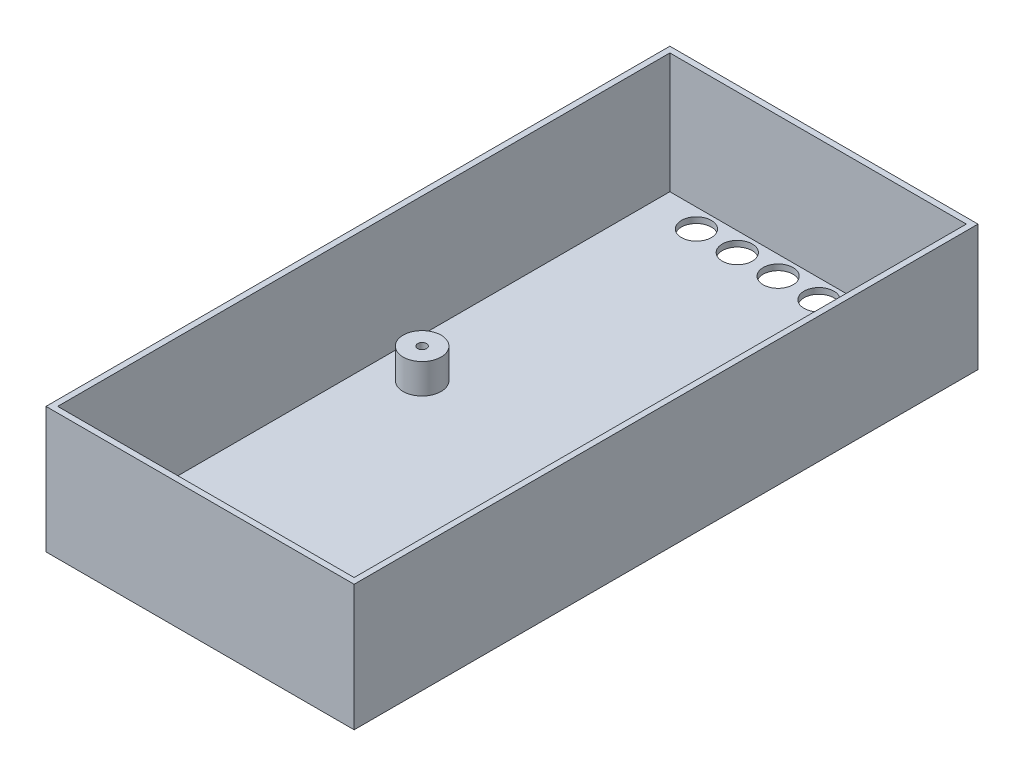
ISO-10303-21;
HEADER;
FILE_DESCRIPTION(('STEP AP214'),'2;1');
FILE_NAME('part.step','',(''),(''),'','','');
FILE_SCHEMA(('AUTOMOTIVE_DESIGN { 1 0 10303 214 1 1 1 1 }'));
ENDSEC;
DATA;
#1=APPLICATION_CONTEXT('core data for automotive mechanical design processes');
#2=APPLICATION_PROTOCOL_DEFINITION('international standard','automotive_design',2000,#1);
#3=PRODUCT_CONTEXT('',#1,'mechanical');
#4=PRODUCT('Part','Part','',(#3));
#5=PRODUCT_RELATED_PRODUCT_CATEGORY('part','',(#4));
#6=PRODUCT_DEFINITION_FORMATION('','',#4);
#7=PRODUCT_DEFINITION_CONTEXT('part definition',#1,'design');
#8=PRODUCT_DEFINITION('design','',#6,#7);
#9=PRODUCT_DEFINITION_SHAPE('','',#8);
#10=(LENGTH_UNIT() NAMED_UNIT(*) SI_UNIT(.MILLI.,.METRE.));
#11=(NAMED_UNIT(*) PLANE_ANGLE_UNIT() SI_UNIT($,.RADIAN.));
#12=(NAMED_UNIT(*) SI_UNIT($,.STERADIAN.) SOLID_ANGLE_UNIT());
#13=UNCERTAINTY_MEASURE_WITH_UNIT(LENGTH_MEASURE(1.E-05),#10,'distance_accuracy_value','');
#14=(GEOMETRIC_REPRESENTATION_CONTEXT(3) GLOBAL_UNCERTAINTY_ASSIGNED_CONTEXT((#13)) GLOBAL_UNIT_ASSIGNED_CONTEXT((#10,
#11,#12)) REPRESENTATION_CONTEXT('',''));
#15=CARTESIAN_POINT('',(0.,0.,0.));
#16=DIRECTION('',(0.,0.,1.));
#17=DIRECTION('',(1.,0.,0.));
#18=AXIS2_PLACEMENT_3D('',#15,#16,#17);
#19=CARTESIAN_POINT('',(0.,1.27,0.));
#20=DIRECTION('',(0.,1.,0.));
#21=DIRECTION('',(0.,0.,1.));
#22=AXIS2_PLACEMENT_3D('',#19,#20,#21);
#23=PLANE('',#22);
#24=CARTESIAN_POINT('',(73.66,1.27,-10.16));
#25=DIRECTION('',(0.,1.,0.));
#26=DIRECTION('',(0.,0.,1.));
#27=AXIS2_PLACEMENT_3D('',#24,#25,#26);
#28=CIRCLE('',#27,4.12750000000001);
#29=CARTESIAN_POINT('',(73.66,1.27,-14.2875));
#30=VERTEX_POINT('',#29);
#31=EDGE_CURVE('E202',#30,#30,#28,.T.);
#32=ORIENTED_EDGE('',*,*,#31,.F.);
#33=EDGE_LOOP('',(#32));
#34=FACE_BOUND('',#33,.T.);
#35=CARTESIAN_POINT('',(46.99,1.27,-68.58));
#36=DIRECTION('',(0.,1.,0.));
#37=DIRECTION('',(0.,0.,1.));
#38=AXIS2_PLACEMENT_3D('',#35,#36,#37);
#39=CIRCLE('',#38,3.25);
#40=CARTESIAN_POINT('',(46.99,1.27,-65.33));
#41=VERTEX_POINT('',#40);
#42=EDGE_CURVE('E233',#41,#41,#39,.T.);
#43=ORIENTED_EDGE('',*,*,#42,.F.);
#44=EDGE_LOOP('',(#43));
#45=FACE_BOUND('',#44,.T.);
#46=CARTESIAN_POINT('',(29.21,1.27,-68.58));
#47=DIRECTION('',(0.,1.,0.));
#48=DIRECTION('',(0.,0.,1.));
#49=AXIS2_PLACEMENT_3D('',#46,#47,#48);
#50=CIRCLE('',#49,3.25);
#51=CARTESIAN_POINT('',(29.21,1.27,-65.33));
#52=VERTEX_POINT('',#51);
#53=EDGE_CURVE('E245',#52,#52,#50,.T.);
#54=ORIENTED_EDGE('',*,*,#53,.F.);
#55=EDGE_LOOP('',(#54));
#56=FACE_BOUND('',#55,.T.);
#57=DIRECTION('',(0.,0.,1.));
#58=VECTOR('',#57,1.);
#59=CARTESIAN_POINT('',(19.304,1.27,-72.7075));
#60=LINE('',#59,#58);
#61=CARTESIAN_POINT('',(19.304,1.27,-72.7075));
#62=VERTEX_POINT('',#61);
#63=CARTESIAN_POINT('',(19.304,1.27,60.5155));
#64=VERTEX_POINT('',#63);
#65=EDGE_CURVE('E275',#62,#64,#60,.T.);
#66=ORIENTED_EDGE('',*,*,#65,.T.);
#67=DIRECTION('',(1.,0.,0.));
#68=VECTOR('',#67,1.);
#69=CARTESIAN_POINT('',(19.304,1.27,60.5155));
#70=LINE('',#69,#68);
#71=CARTESIAN_POINT('',(83.82,1.27,60.5155));
#72=VERTEX_POINT('',#71);
#73=EDGE_CURVE('E278',#64,#72,#70,.T.);
#74=ORIENTED_EDGE('',*,*,#73,.T.);
#75=DIRECTION('',(0.,0.,-1.));
#76=VECTOR('',#75,1.);
#77=CARTESIAN_POINT('',(83.82,1.27,-72.7075));
#78=LINE('',#77,#76);
#79=CARTESIAN_POINT('',(83.82,1.27,-72.7075));
#80=VERTEX_POINT('',#79);
#81=EDGE_CURVE('E43',#72,#80,#78,.T.);
#82=ORIENTED_EDGE('',*,*,#81,.T.);
#83=DIRECTION('',(-1.,0.,0.));
#84=VECTOR('',#83,1.);
#85=CARTESIAN_POINT('',(19.304,1.27,-72.7075));
#86=LINE('',#85,#84);
#87=EDGE_CURVE('E11',#80,#62,#86,.T.);
#88=ORIENTED_EDGE('',*,*,#87,.T.);
#89=EDGE_LOOP('',(#66,#74,#82,#88));
#90=FACE_BOUND('',#89,.T.);
#91=DIRECTION('',(1.,0.,0.));
#92=VECTOR('',#91,1.);
#93=CARTESIAN_POINT('',(64.516,1.27,-45.466));
#94=LINE('',#93,#92);
#95=CARTESIAN_POINT('',(64.516,1.27,-45.466));
#96=VERTEX_POINT('',#95);
#97=CARTESIAN_POINT('',(77.724,1.27,-45.466));
#98=VERTEX_POINT('',#97);
#99=EDGE_CURVE('E252',#96,#98,#94,.T.);
#100=ORIENTED_EDGE('',*,*,#99,.F.);
#101=DIRECTION('',(0.,0.,1.));
#102=VECTOR('',#101,1.);
#103=CARTESIAN_POINT('',(64.516,1.27,-58.674));
#104=LINE('',#103,#102);
#105=CARTESIAN_POINT('',(64.516,1.27,-58.674));
#106=VERTEX_POINT('',#105);
#107=EDGE_CURVE('E250',#106,#96,#104,.T.);
#108=ORIENTED_EDGE('',*,*,#107,.F.);
#109=DIRECTION('',(-1.,0.,0.));
#110=VECTOR('',#109,1.);
#111=CARTESIAN_POINT('',(64.516,1.27,-58.674));
#112=LINE('',#111,#110);
#113=CARTESIAN_POINT('',(77.724,1.27,-58.674));
#114=VERTEX_POINT('',#113);
#115=EDGE_CURVE('E257',#114,#106,#112,.T.);
#116=ORIENTED_EDGE('',*,*,#115,.F.);
#117=DIRECTION('',(0.,0.,-1.));
#118=VECTOR('',#117,1.);
#119=CARTESIAN_POINT('',(77.724,1.27,-58.674));
#120=LINE('',#119,#118);
#121=EDGE_CURVE('E255',#98,#114,#120,.T.);
#122=ORIENTED_EDGE('',*,*,#121,.F.);
#123=EDGE_LOOP('',(#100,#108,#116,#122));
#124=FACE_BOUND('',#123,.T.);
#125=CARTESIAN_POINT('',(38.1,1.27,-68.58));
#126=DIRECTION('',(0.,1.,0.));
#127=DIRECTION('',(0.,0.,1.));
#128=AXIS2_PLACEMENT_3D('',#125,#126,#127);
#129=CIRCLE('',#128,3.25);
#130=CARTESIAN_POINT('',(38.1,1.27,-65.33));
#131=VERTEX_POINT('',#130);
#132=EDGE_CURVE('E239',#131,#131,#129,.T.);
#133=ORIENTED_EDGE('',*,*,#132,.F.);
#134=EDGE_LOOP('',(#133));
#135=FACE_BOUND('',#134,.T.);
#136=CARTESIAN_POINT('',(55.88,1.27,-68.58));
#137=DIRECTION('',(0.,1.,0.));
#138=DIRECTION('',(0.,0.,1.));
#139=AXIS2_PLACEMENT_3D('',#136,#137,#138);
#140=CIRCLE('',#139,3.25);
#141=CARTESIAN_POINT('',(55.88,1.27,-65.33));
#142=VERTEX_POINT('',#141);
#143=EDGE_CURVE('E227',#142,#142,#140,.T.);
#144=ORIENTED_EDGE('',*,*,#143,.F.);
#145=EDGE_LOOP('',(#144));
#146=FACE_BOUND('',#145,.T.);
#147=CARTESIAN_POINT('',(27.94,1.27,-10.16));
#148=DIRECTION('',(0.,1.,0.));
#149=DIRECTION('',(0.,0.,1.));
#150=AXIS2_PLACEMENT_3D('',#147,#148,#149);
#151=CIRCLE('',#150,4.12750000000001);
#152=CARTESIAN_POINT('',(27.94,1.27,-14.2875));
#153=VERTEX_POINT('',#152);
#154=EDGE_CURVE('E211',#153,#153,#151,.T.);
#155=ORIENTED_EDGE('',*,*,#154,.F.);
#156=EDGE_LOOP('',(#155));
#157=FACE_BOUND('',#156,.T.);
#158=CARTESIAN_POINT('',(73.66,1.27,-68.58));
#159=DIRECTION('',(0.,1.,0.));
#160=DIRECTION('',(0.,0.,1.));
#161=AXIS2_PLACEMENT_3D('',#158,#159,#160);
#162=CIRCLE('',#161,4.064);
#163=CARTESIAN_POINT('',(73.66,1.27,-72.644));
#164=VERTEX_POINT('',#163);
#165=EDGE_CURVE('E193',#164,#164,#162,.T.);
#166=ORIENTED_EDGE('',*,*,#165,.F.);
#167=EDGE_LOOP('',(#166));
#168=FACE_BOUND('',#167,.T.);
#169=ADVANCED_FACE('F35',(#34,#45,#56,#90,#124,#135,#146,#157,#168),#23,.T.);
#170=CARTESIAN_POINT('',(0.,0.,0.));
#171=DIRECTION('',(0.,1.,0.));
#172=DIRECTION('',(0.,0.,1.));
#173=AXIS2_PLACEMENT_3D('',#170,#171,#172);
#174=PLANE('',#173);
#175=DIRECTION('',(0.,0.,-1.));
#176=VECTOR('',#175,1.);
#177=CARTESIAN_POINT('',(85.09,0.,87.9768824123987));
#178=LINE('',#177,#176);
#179=CARTESIAN_POINT('',(85.09,0.,61.7855));
#180=VERTEX_POINT('',#179);
#181=CARTESIAN_POINT('',(85.09,0.,-73.9775));
#182=VERTEX_POINT('',#181);
#183=EDGE_CURVE('E136',#180,#182,#178,.T.);
#184=ORIENTED_EDGE('',*,*,#183,.F.);
#185=DIRECTION('',(1.,0.,0.));
#186=VECTOR('',#185,1.);
#187=CARTESIAN_POINT('',(-9.42738241239872,0.,61.7855));
#188=LINE('',#187,#186);
#189=CARTESIAN_POINT('',(18.034,0.,61.7855));
#190=VERTEX_POINT('',#189);
#191=EDGE_CURVE('E163',#190,#180,#188,.T.);
#192=ORIENTED_EDGE('',*,*,#191,.F.);
#193=DIRECTION('',(0.,0.,-1.));
#194=VECTOR('',#193,1.);
#195=CARTESIAN_POINT('',(18.034,0.,87.9768824123987));
#196=LINE('',#195,#194);
#197=CARTESIAN_POINT('',(18.034,0.,-73.9775));
#198=VERTEX_POINT('',#197);
#199=EDGE_CURVE('E178',#190,#198,#196,.T.);
#200=ORIENTED_EDGE('',*,*,#199,.T.);
#201=DIRECTION('',(-1.,0.,0.));
#202=VECTOR('',#201,1.);
#203=CARTESIAN_POINT('',(85.09,0.,-73.9775));
#204=LINE('',#203,#202);
#205=EDGE_CURVE('E145',#182,#198,#204,.T.);
#206=ORIENTED_EDGE('',*,*,#205,.F.);
#207=EDGE_LOOP('',(#184,#192,#200,#206));
#208=FACE_BOUND('',#207,.T.);
#209=DIRECTION('',(0.,0.,1.));
#210=VECTOR('',#209,1.);
#211=CARTESIAN_POINT('',(64.516,0.,-58.674));
#212=LINE('',#211,#210);
#213=CARTESIAN_POINT('',(64.516,0.,-58.674));
#214=VERTEX_POINT('',#213);
#215=CARTESIAN_POINT('',(64.516,0.,-45.466));
#216=VERTEX_POINT('',#215);
#217=EDGE_CURVE('E58',#214,#216,#212,.T.);
#218=ORIENTED_EDGE('',*,*,#217,.T.);
#219=DIRECTION('',(1.,0.,0.));
#220=VECTOR('',#219,1.);
#221=CARTESIAN_POINT('',(64.516,0.,-45.466));
#222=LINE('',#221,#220);
#223=CARTESIAN_POINT('',(77.724,0.,-45.466));
#224=VERTEX_POINT('',#223);
#225=EDGE_CURVE('E261',#216,#224,#222,.T.);
#226=ORIENTED_EDGE('',*,*,#225,.T.);
#227=DIRECTION('',(0.,0.,-1.));
#228=VECTOR('',#227,1.);
#229=CARTESIAN_POINT('',(77.724,0.,-58.674));
#230=LINE('',#229,#228);
#231=CARTESIAN_POINT('',(77.724,0.,-58.674));
#232=VERTEX_POINT('',#231);
#233=EDGE_CURVE('E264',#224,#232,#230,.T.);
#234=ORIENTED_EDGE('',*,*,#233,.T.);
#235=DIRECTION('',(-1.,0.,0.));
#236=VECTOR('',#235,1.);
#237=CARTESIAN_POINT('',(64.516,0.,-58.674));
#238=LINE('',#237,#236);
#239=EDGE_CURVE('E253',#232,#214,#238,.T.);
#240=ORIENTED_EDGE('',*,*,#239,.T.);
#241=EDGE_LOOP('',(#218,#226,#234,#240));
#242=FACE_BOUND('',#241,.T.);
#243=CARTESIAN_POINT('',(29.21,0.,-68.58));
#244=DIRECTION('',(0.,1.,0.));
#245=DIRECTION('',(0.,0.,1.));
#246=AXIS2_PLACEMENT_3D('',#243,#244,#245);
#247=CIRCLE('',#246,3.25);
#248=CARTESIAN_POINT('',(29.21,0.,-65.33));
#249=VERTEX_POINT('',#248);
#250=EDGE_CURVE('E242',#249,#249,#247,.T.);
#251=ORIENTED_EDGE('',*,*,#250,.T.);
#252=EDGE_LOOP('',(#251));
#253=FACE_BOUND('',#252,.T.);
#254=CARTESIAN_POINT('',(38.1,0.,-68.58));
#255=DIRECTION('',(0.,1.,0.));
#256=DIRECTION('',(0.,0.,1.));
#257=AXIS2_PLACEMENT_3D('',#254,#255,#256);
#258=CIRCLE('',#257,3.25);
#259=CARTESIAN_POINT('',(38.1,0.,-65.33));
#260=VERTEX_POINT('',#259);
#261=EDGE_CURVE('E236',#260,#260,#258,.T.);
#262=ORIENTED_EDGE('',*,*,#261,.T.);
#263=EDGE_LOOP('',(#262));
#264=FACE_BOUND('',#263,.T.);
#265=CARTESIAN_POINT('',(46.99,0.,-68.58));
#266=DIRECTION('',(0.,1.,0.));
#267=DIRECTION('',(0.,0.,1.));
#268=AXIS2_PLACEMENT_3D('',#265,#266,#267);
#269=CIRCLE('',#268,3.25);
#270=CARTESIAN_POINT('',(46.99,0.,-65.33));
#271=VERTEX_POINT('',#270);
#272=EDGE_CURVE('E230',#271,#271,#269,.T.);
#273=ORIENTED_EDGE('',*,*,#272,.T.);
#274=EDGE_LOOP('',(#273));
#275=FACE_BOUND('',#274,.T.);
#276=CARTESIAN_POINT('',(55.88,0.,-68.58));
#277=DIRECTION('',(0.,1.,0.));
#278=DIRECTION('',(0.,0.,1.));
#279=AXIS2_PLACEMENT_3D('',#276,#277,#278);
#280=CIRCLE('',#279,3.25);
#281=CARTESIAN_POINT('',(55.88,0.,-65.33));
#282=VERTEX_POINT('',#281);
#283=EDGE_CURVE('E226',#282,#282,#280,.T.);
#284=ORIENTED_EDGE('',*,*,#283,.T.);
#285=EDGE_LOOP('',(#284));
#286=FACE_BOUND('',#285,.T.);
#287=CARTESIAN_POINT('',(73.66,0.,-68.58));
#288=DIRECTION('',(0.,1.,0.));
#289=DIRECTION('',(0.,0.,1.));
#290=AXIS2_PLACEMENT_3D('',#287,#288,#289);
#291=CIRCLE('',#290,0.965199999999997);
#292=CARTESIAN_POINT('',(73.66,0.,-67.6148));
#293=VERTEX_POINT('',#292);
#294=EDGE_CURVE('E223',#293,#293,#291,.T.);
#295=ORIENTED_EDGE('',*,*,#294,.T.);
#296=EDGE_LOOP('',(#295));
#297=FACE_BOUND('',#296,.T.);
#298=CARTESIAN_POINT('',(73.66,0.,-10.16));
#299=DIRECTION('',(0.,1.,0.));
#300=DIRECTION('',(0.,0.,1.));
#301=AXIS2_PLACEMENT_3D('',#298,#299,#300);
#302=CIRCLE('',#301,0.965199999999998);
#303=CARTESIAN_POINT('',(73.66,0.,-9.1948));
#304=VERTEX_POINT('',#303);
#305=EDGE_CURVE('E220',#304,#304,#302,.T.);
#306=ORIENTED_EDGE('',*,*,#305,.T.);
#307=EDGE_LOOP('',(#306));
#308=FACE_BOUND('',#307,.T.);
#309=CARTESIAN_POINT('',(27.94,0.,-10.16));
#310=DIRECTION('',(0.,1.,0.));
#311=DIRECTION('',(0.,0.,1.));
#312=AXIS2_PLACEMENT_3D('',#309,#310,#311);
#313=CIRCLE('',#312,0.965199999999998);
#314=CARTESIAN_POINT('',(27.94,0.,-9.1948));
#315=VERTEX_POINT('',#314);
#316=EDGE_CURVE('E215',#315,#315,#313,.T.);
#317=ORIENTED_EDGE('',*,*,#316,.T.);
#318=EDGE_LOOP('',(#317));
#319=FACE_BOUND('',#318,.T.);
#320=ADVANCED_FACE('F37',(#208,#242,#253,#264,#275,#286,#297,#308,#319),#174,.F.);
#321=CARTESIAN_POINT('',(64.516,1.27,-58.674));
#322=DIRECTION('',(1.,0.,0.));
#323=DIRECTION('',(0.,0.,-1.));
#324=AXIS2_PLACEMENT_3D('',#321,#322,#323);
#325=PLANE('',#324);
#326=ORIENTED_EDGE('',*,*,#217,.F.);
#327=DIRECTION('',(0.,-1.,0.));
#328=VECTOR('',#327,1.);
#329=CARTESIAN_POINT('',(64.516,1.27,-58.674));
#330=LINE('',#329,#328);
#331=EDGE_CURVE('E259',#106,#214,#330,.T.);
#332=ORIENTED_EDGE('',*,*,#331,.F.);
#333=ORIENTED_EDGE('',*,*,#107,.T.);
#334=DIRECTION('',(0.,-1.,0.));
#335=VECTOR('',#334,1.);
#336=CARTESIAN_POINT('',(64.516,1.27,-45.466));
#337=LINE('',#336,#335);
#338=EDGE_CURVE('E273',#96,#216,#337,.T.);
#339=ORIENTED_EDGE('',*,*,#338,.T.);
#340=EDGE_LOOP('',(#326,#332,#333,#339));
#341=FACE_BOUND('',#340,.T.);
#342=ADVANCED_FACE('F313',(#341),#325,.T.);
#343=CARTESIAN_POINT('',(64.516,1.27,-45.466));
#344=DIRECTION('',(0.,0.,-1.));
#345=DIRECTION('',(-1.,0.,0.));
#346=AXIS2_PLACEMENT_3D('',#343,#344,#345);
#347=PLANE('',#346);
#348=ORIENTED_EDGE('',*,*,#225,.F.);
#349=ORIENTED_EDGE('',*,*,#338,.F.);
#350=ORIENTED_EDGE('',*,*,#99,.T.);
#351=DIRECTION('',(0.,-1.,0.));
#352=VECTOR('',#351,1.);
#353=CARTESIAN_POINT('',(77.724,1.27,-45.466));
#354=LINE('',#353,#352);
#355=EDGE_CURVE('E271',#98,#224,#354,.T.);
#356=ORIENTED_EDGE('',*,*,#355,.T.);
#357=EDGE_LOOP('',(#348,#349,#350,#356));
#358=FACE_BOUND('',#357,.T.);
#359=ADVANCED_FACE('F320',(#358),#347,.T.);
#360=CARTESIAN_POINT('',(77.724,1.27,-58.674));
#361=DIRECTION('',(-1.,0.,0.));
#362=DIRECTION('',(0.,0.,1.));
#363=AXIS2_PLACEMENT_3D('',#360,#361,#362);
#364=PLANE('',#363);
#365=ORIENTED_EDGE('',*,*,#233,.F.);
#366=ORIENTED_EDGE('',*,*,#355,.F.);
#367=ORIENTED_EDGE('',*,*,#121,.T.);
#368=DIRECTION('',(0.,-1.,0.));
#369=VECTOR('',#368,1.);
#370=CARTESIAN_POINT('',(77.724,1.27,-58.674));
#371=LINE('',#370,#369);
#372=EDGE_CURVE('E50',#114,#232,#371,.T.);
#373=ORIENTED_EDGE('',*,*,#372,.T.);
#374=EDGE_LOOP('',(#365,#366,#367,#373));
#375=FACE_BOUND('',#374,.T.);
#376=ADVANCED_FACE('F323',(#375),#364,.T.);
#377=CARTESIAN_POINT('',(64.516,1.27,-58.674));
#378=DIRECTION('',(0.,0.,1.));
#379=DIRECTION('',(1.,0.,0.));
#380=AXIS2_PLACEMENT_3D('',#377,#378,#379);
#381=PLANE('',#380);
#382=ORIENTED_EDGE('',*,*,#239,.F.);
#383=ORIENTED_EDGE('',*,*,#372,.F.);
#384=ORIENTED_EDGE('',*,*,#115,.T.);
#385=ORIENTED_EDGE('',*,*,#331,.T.);
#386=EDGE_LOOP('',(#382,#383,#384,#385));
#387=FACE_BOUND('',#386,.T.);
#388=ADVANCED_FACE('F327',(#387),#381,.T.);
#389=CARTESIAN_POINT('',(29.21,1.27,-68.58));
#390=DIRECTION('',(0.,-1.,0.));
#391=DIRECTION('',(0.,0.,-1.));
#392=AXIS2_PLACEMENT_3D('',#389,#390,#391);
#393=CYLINDRICAL_SURFACE('',#392,3.25);
#394=ORIENTED_EDGE('',*,*,#53,.T.);
#395=EDGE_LOOP('',(#394));
#396=FACE_BOUND('',#395,.T.);
#397=ORIENTED_EDGE('',*,*,#250,.F.);
#398=EDGE_LOOP('',(#397));
#399=FACE_BOUND('',#398,.T.);
#400=ADVANCED_FACE('F331',(#396,#399),#393,.F.);
#401=CARTESIAN_POINT('',(38.1,1.27,-68.58));
#402=DIRECTION('',(0.,-1.,0.));
#403=DIRECTION('',(0.,0.,-1.));
#404=AXIS2_PLACEMENT_3D('',#401,#402,#403);
#405=CYLINDRICAL_SURFACE('',#404,3.25);
#406=ORIENTED_EDGE('',*,*,#132,.T.);
#407=EDGE_LOOP('',(#406));
#408=FACE_BOUND('',#407,.T.);
#409=ORIENTED_EDGE('',*,*,#261,.F.);
#410=EDGE_LOOP('',(#409));
#411=FACE_BOUND('',#410,.T.);
#412=ADVANCED_FACE('F334',(#408,#411),#405,.F.);
#413=CARTESIAN_POINT('',(46.99,1.27,-68.58));
#414=DIRECTION('',(0.,-1.,0.));
#415=DIRECTION('',(0.,0.,-1.));
#416=AXIS2_PLACEMENT_3D('',#413,#414,#415);
#417=CYLINDRICAL_SURFACE('',#416,3.25);
#418=ORIENTED_EDGE('',*,*,#42,.T.);
#419=EDGE_LOOP('',(#418));
#420=FACE_BOUND('',#419,.T.);
#421=ORIENTED_EDGE('',*,*,#272,.F.);
#422=EDGE_LOOP('',(#421));
#423=FACE_BOUND('',#422,.T.);
#424=ADVANCED_FACE('F338',(#420,#423),#417,.F.);
#425=CARTESIAN_POINT('',(55.88,1.27,-68.58));
#426=DIRECTION('',(0.,-1.,0.));
#427=DIRECTION('',(0.,0.,-1.));
#428=AXIS2_PLACEMENT_3D('',#425,#426,#427);
#429=CYLINDRICAL_SURFACE('',#428,3.25);
#430=ORIENTED_EDGE('',*,*,#143,.T.);
#431=EDGE_LOOP('',(#430));
#432=FACE_BOUND('',#431,.T.);
#433=ORIENTED_EDGE('',*,*,#283,.F.);
#434=EDGE_LOOP('',(#433));
#435=FACE_BOUND('',#434,.T.);
#436=ADVANCED_FACE('F342',(#432,#435),#429,.F.);
#437=CARTESIAN_POINT('',(73.66,1.27,-68.58));
#438=DIRECTION('',(0.,-1.,0.));
#439=DIRECTION('',(0.,0.,-1.));
#440=AXIS2_PLACEMENT_3D('',#437,#438,#439);
#441=CYLINDRICAL_SURFACE('',#440,0.965199999999997);
#442=ORIENTED_EDGE('',*,*,#294,.F.);
#443=EDGE_LOOP('',(#442));
#444=FACE_BOUND('',#443,.T.);
#445=CARTESIAN_POINT('',(73.66,7.77,-68.58));
#446=DIRECTION('',(0.,1.,0.));
#447=DIRECTION('',(0.,0.,1.));
#448=AXIS2_PLACEMENT_3D('',#445,#446,#447);
#449=CIRCLE('',#448,0.965199999999997);
#450=CARTESIAN_POINT('',(73.66,7.77,-67.6148));
#451=VERTEX_POINT('',#450);
#452=EDGE_CURVE('E186',#451,#451,#449,.T.);
#453=ORIENTED_EDGE('',*,*,#452,.T.);
#454=EDGE_LOOP('',(#453));
#455=FACE_BOUND('',#454,.T.);
#456=ADVANCED_FACE('F346',(#444,#455),#441,.F.);
#457=CARTESIAN_POINT('',(73.66,1.27,-10.16));
#458=DIRECTION('',(0.,-1.,0.));
#459=DIRECTION('',(0.,0.,-1.));
#460=AXIS2_PLACEMENT_3D('',#457,#458,#459);
#461=CYLINDRICAL_SURFACE('',#460,0.965199999999998);
#462=ORIENTED_EDGE('',*,*,#305,.F.);
#463=EDGE_LOOP('',(#462));
#464=FACE_BOUND('',#463,.T.);
#465=CARTESIAN_POINT('',(73.66,7.77,-10.16));
#466=DIRECTION('',(0.,1.,0.));
#467=DIRECTION('',(0.,0.,1.));
#468=AXIS2_PLACEMENT_3D('',#465,#466,#467);
#469=CIRCLE('',#468,0.965199999999997);
#470=CARTESIAN_POINT('',(73.66,7.77,-9.1948));
#471=VERTEX_POINT('',#470);
#472=EDGE_CURVE('E197',#471,#471,#469,.T.);
#473=ORIENTED_EDGE('',*,*,#472,.T.);
#474=EDGE_LOOP('',(#473));
#475=FACE_BOUND('',#474,.T.);
#476=ADVANCED_FACE('F350',(#464,#475),#461,.F.);
#477=CARTESIAN_POINT('',(27.94,1.27,-10.16));
#478=DIRECTION('',(0.,-1.,0.));
#479=DIRECTION('',(0.,0.,-1.));
#480=AXIS2_PLACEMENT_3D('',#477,#478,#479);
#481=CYLINDRICAL_SURFACE('',#480,0.965199999999998);
#482=ORIENTED_EDGE('',*,*,#316,.F.);
#483=EDGE_LOOP('',(#482));
#484=FACE_BOUND('',#483,.T.);
#485=CARTESIAN_POINT('',(27.94,7.77,-10.16));
#486=DIRECTION('',(0.,1.,0.));
#487=DIRECTION('',(0.,0.,1.));
#488=AXIS2_PLACEMENT_3D('',#485,#486,#487);
#489=CIRCLE('',#488,0.965199999999998);
#490=CARTESIAN_POINT('',(27.94,7.77,-9.1948));
#491=VERTEX_POINT('',#490);
#492=EDGE_CURVE('E206',#491,#491,#489,.T.);
#493=ORIENTED_EDGE('',*,*,#492,.T.);
#494=EDGE_LOOP('',(#493));
#495=FACE_BOUND('',#494,.T.);
#496=ADVANCED_FACE('F354',(#484,#495),#481,.F.);
#497=CARTESIAN_POINT('',(27.94,7.77,-10.16));
#498=DIRECTION('',(0.,1.,0.));
#499=DIRECTION('',(0.,0.,1.));
#500=AXIS2_PLACEMENT_3D('',#497,#498,#499);
#501=PLANE('',#500);
#502=CARTESIAN_POINT('',(27.94,7.77,-10.16));
#503=DIRECTION('',(0.,1.,0.));
#504=DIRECTION('',(0.,0.,1.));
#505=AXIS2_PLACEMENT_3D('',#502,#503,#504);
#506=CIRCLE('',#505,4.12750000000001);
#507=CARTESIAN_POINT('',(27.94,7.77,-14.2875));
#508=VERTEX_POINT('',#507);
#509=EDGE_CURVE('E212',#508,#508,#506,.T.);
#510=ORIENTED_EDGE('',*,*,#509,.T.);
#511=EDGE_LOOP('',(#510));
#512=FACE_BOUND('',#511,.T.);
#513=ORIENTED_EDGE('',*,*,#492,.F.);
#514=EDGE_LOOP('',(#513));
#515=FACE_BOUND('',#514,.T.);
#516=ADVANCED_FACE('F358',(#512,#515),#501,.T.);
#517=CARTESIAN_POINT('',(27.94,7.77,-10.16));
#518=DIRECTION('',(0.,-1.,0.));
#519=DIRECTION('',(0.,0.,-1.));
#520=AXIS2_PLACEMENT_3D('',#517,#518,#519);
#521=CYLINDRICAL_SURFACE('',#520,4.12750000000001);
#522=CARTESIAN_POINT('',(27.94,7.77,-14.2875));
#523=CARTESIAN_POINT('',(27.94,7.70229166666667,-14.2875));
#524=CARTESIAN_POINT('',(27.94,7.63458333333333,-14.2875));
#525=CARTESIAN_POINT('',(27.94,7.49916666666667,-14.2875));
#526=CARTESIAN_POINT('',(27.94,7.43145833333333,-14.2875));
#527=CARTESIAN_POINT('',(27.94,7.29604166666667,-14.2875));
#528=CARTESIAN_POINT('',(27.94,7.22833333333333,-14.2875));
#529=CARTESIAN_POINT('',(27.94,7.09291666666667,-14.2875));
#530=CARTESIAN_POINT('',(27.94,7.02520833333333,-14.2875));
#531=CARTESIAN_POINT('',(27.94,6.88979166666667,-14.2875));
#532=CARTESIAN_POINT('',(27.94,6.82208333333333,-14.2875));
#533=CARTESIAN_POINT('',(27.94,6.68666666666667,-14.2875));
#534=CARTESIAN_POINT('',(27.94,6.61895833333333,-14.2875));
#535=CARTESIAN_POINT('',(27.94,6.48354166666667,-14.2875));
#536=CARTESIAN_POINT('',(27.94,6.41583333333333,-14.2875));
#537=CARTESIAN_POINT('',(27.94,6.28041666666667,-14.2875));
#538=CARTESIAN_POINT('',(27.94,6.21270833333333,-14.2875));
#539=CARTESIAN_POINT('',(27.94,6.07729166666667,-14.2875));
#540=CARTESIAN_POINT('',(27.94,6.00958333333333,-14.2875));
#541=CARTESIAN_POINT('',(27.94,5.87416666666667,-14.2875));
#542=CARTESIAN_POINT('',(27.94,5.80645833333333,-14.2875));
#543=CARTESIAN_POINT('',(27.94,5.67104166666667,-14.2875));
#544=CARTESIAN_POINT('',(27.94,5.60333333333333,-14.2875));
#545=CARTESIAN_POINT('',(27.94,5.46791666666667,-14.2875));
#546=CARTESIAN_POINT('',(27.94,5.40020833333333,-14.2875));
#547=CARTESIAN_POINT('',(27.94,5.26479166666667,-14.2875));
#548=CARTESIAN_POINT('',(27.94,5.19708333333333,-14.2875));
#549=CARTESIAN_POINT('',(27.94,5.06166666666667,-14.2875));
#550=CARTESIAN_POINT('',(27.94,4.99395833333333,-14.2875));
#551=CARTESIAN_POINT('',(27.94,4.85854166666667,-14.2875));
#552=CARTESIAN_POINT('',(27.94,4.79083333333333,-14.2875));
#553=CARTESIAN_POINT('',(27.94,4.65541666666667,-14.2875));
#554=CARTESIAN_POINT('',(27.94,4.58770833333333,-14.2875));
#555=CARTESIAN_POINT('',(27.94,4.45229166666667,-14.2875));
#556=CARTESIAN_POINT('',(27.94,4.38458333333333,-14.2875));
#557=CARTESIAN_POINT('',(27.94,4.24916666666667,-14.2875));
#558=CARTESIAN_POINT('',(27.94,4.18145833333333,-14.2875));
#559=CARTESIAN_POINT('',(27.94,4.04604166666667,-14.2875));
#560=CARTESIAN_POINT('',(27.94,3.97833333333333,-14.2875));
#561=CARTESIAN_POINT('',(27.94,3.84291666666667,-14.2875));
#562=CARTESIAN_POINT('',(27.94,3.77520833333333,-14.2875));
#563=CARTESIAN_POINT('',(27.94,3.63979166666667,-14.2875));
#564=CARTESIAN_POINT('',(27.94,3.57208333333333,-14.2875));
#565=CARTESIAN_POINT('',(27.94,3.43666666666667,-14.2875));
#566=CARTESIAN_POINT('',(27.94,3.36895833333333,-14.2875));
#567=CARTESIAN_POINT('',(27.94,3.23354166666667,-14.2875));
#568=CARTESIAN_POINT('',(27.94,3.16583333333333,-14.2875));
#569=CARTESIAN_POINT('',(27.94,3.03041666666667,-14.2875));
#570=CARTESIAN_POINT('',(27.94,2.96270833333333,-14.2875));
#571=CARTESIAN_POINT('',(27.94,2.82729166666667,-14.2875));
#572=CARTESIAN_POINT('',(27.94,2.75958333333333,-14.2875));
#573=CARTESIAN_POINT('',(27.94,2.62416666666667,-14.2875));
#574=CARTESIAN_POINT('',(27.94,2.55645833333333,-14.2875));
#575=CARTESIAN_POINT('',(27.94,2.42104166666667,-14.2875));
#576=CARTESIAN_POINT('',(27.94,2.35333333333333,-14.2875));
#577=CARTESIAN_POINT('',(27.94,2.21791666666667,-14.2875));
#578=CARTESIAN_POINT('',(27.94,2.15020833333333,-14.2875));
#579=CARTESIAN_POINT('',(27.94,2.01479166666667,-14.2875));
#580=CARTESIAN_POINT('',(27.94,1.94708333333333,-14.2875));
#581=CARTESIAN_POINT('',(27.94,1.81166666666667,-14.2875));
#582=CARTESIAN_POINT('',(27.94,1.74395833333333,-14.2875));
#583=CARTESIAN_POINT('',(27.94,1.60854166666667,-14.2875));
#584=CARTESIAN_POINT('',(27.94,1.54083333333333,-14.2875));
#585=CARTESIAN_POINT('',(27.94,1.40541666666667,-14.2875));
#586=CARTESIAN_POINT('',(27.94,1.33770833333333,-14.2875));
#587=CARTESIAN_POINT('',(27.94,1.27,-14.2875));
#588=B_SPLINE_CURVE_WITH_KNOTS('',3,(#522,#523,#524,#525,#526,#527,#528,#529,#530,#531,#532,
#533,#534,#535,#536,#537,#538,#539,#540,#541,#542,#543,#544,#545,#546,#547,#548,#549,#550,#551,
#552,#553,#554,#555,#556,#557,#558,#559,#560,#561,#562,#563,#564,#565,#566,#567,#568,#569,#570,
#571,#572,#573,#574,#575,#576,#577,#578,#579,#580,#581,#582,#583,#584,#585,#586,#587),
.UNSPECIFIED.,.F.,.F.,(4,2,2,2,2,2,2,2,2,2,2,2,2,2,2,2,2,2,2,2,2,2,2,2,2,2,2,2,2,2,2,2,4),(0.,
0.203125,0.40625,0.609375000000001,0.812500000000001,1.015625,1.21875,1.421875,1.625,1.828125,
2.03125,2.234375,2.4375,2.640625,2.84375,3.046875,3.25,3.453125,3.65625,3.859375,4.0625,
4.265625,4.46875,4.671875,4.875,5.078125,5.28125,5.484375,5.6875,5.890625,6.09375,6.296875,6.5),.UNSPECIFIED.);
#589=EDGE_CURVE('BSEAM360',#508,#153,#588,.T.);
#590=ORIENTED_EDGE('',*,*,#509,.F.);
#591=ORIENTED_EDGE('',*,*,#154,.T.);
#592=ORIENTED_EDGE('',*,*,#589,.T.);
#593=ORIENTED_EDGE('',*,*,#589,.F.);
#594=EDGE_LOOP('',(#590,#592,#591,#593));
#595=FACE_BOUND('',#594,.T.);
#596=ADVANCED_FACE('F360',(#595),#521,.T.);
#597=CARTESIAN_POINT('',(73.66,7.77,-10.16));
#598=DIRECTION('',(0.,1.,0.));
#599=DIRECTION('',(0.,0.,1.));
#600=AXIS2_PLACEMENT_3D('',#597,#598,#599);
#601=PLANE('',#600);
#602=CARTESIAN_POINT('',(73.66,7.77,-10.16));
#603=DIRECTION('',(0.,1.,0.));
#604=DIRECTION('',(0.,0.,1.));
#605=AXIS2_PLACEMENT_3D('',#602,#603,#604);
#606=CIRCLE('',#605,4.12750000000001);
#607=CARTESIAN_POINT('',(73.66,7.77,-14.2875));
#608=VERTEX_POINT('',#607);
#609=EDGE_CURVE('E203',#608,#608,#606,.T.);
#610=ORIENTED_EDGE('',*,*,#609,.T.);
#611=EDGE_LOOP('',(#610));
#612=FACE_BOUND('',#611,.T.);
#613=ORIENTED_EDGE('',*,*,#472,.F.);
#614=EDGE_LOOP('',(#613));
#615=FACE_BOUND('',#614,.T.);
#616=ADVANCED_FACE('F363',(#612,#615),#601,.T.);
#617=CARTESIAN_POINT('',(73.66,7.77,-10.16));
#618=DIRECTION('',(0.,-1.,0.));
#619=DIRECTION('',(0.,0.,-1.));
#620=AXIS2_PLACEMENT_3D('',#617,#618,#619);
#621=CYLINDRICAL_SURFACE('',#620,4.12750000000001);
#622=CARTESIAN_POINT('',(73.66,7.77,-14.2875));
#623=CARTESIAN_POINT('',(73.66,7.70229166666667,-14.2875));
#624=CARTESIAN_POINT('',(73.66,7.63458333333333,-14.2875));
#625=CARTESIAN_POINT('',(73.66,7.49916666666667,-14.2875));
#626=CARTESIAN_POINT('',(73.66,7.43145833333333,-14.2875));
#627=CARTESIAN_POINT('',(73.66,7.29604166666667,-14.2875));
#628=CARTESIAN_POINT('',(73.66,7.22833333333333,-14.2875));
#629=CARTESIAN_POINT('',(73.66,7.09291666666667,-14.2875));
#630=CARTESIAN_POINT('',(73.66,7.02520833333333,-14.2875));
#631=CARTESIAN_POINT('',(73.66,6.88979166666667,-14.2875));
#632=CARTESIAN_POINT('',(73.66,6.82208333333333,-14.2875));
#633=CARTESIAN_POINT('',(73.66,6.68666666666667,-14.2875));
#634=CARTESIAN_POINT('',(73.66,6.61895833333333,-14.2875));
#635=CARTESIAN_POINT('',(73.66,6.48354166666667,-14.2875));
#636=CARTESIAN_POINT('',(73.66,6.41583333333333,-14.2875));
#637=CARTESIAN_POINT('',(73.66,6.28041666666667,-14.2875));
#638=CARTESIAN_POINT('',(73.66,6.21270833333333,-14.2875));
#639=CARTESIAN_POINT('',(73.66,6.07729166666667,-14.2875));
#640=CARTESIAN_POINT('',(73.66,6.00958333333333,-14.2875));
#641=CARTESIAN_POINT('',(73.66,5.87416666666667,-14.2875));
#642=CARTESIAN_POINT('',(73.66,5.80645833333333,-14.2875));
#643=CARTESIAN_POINT('',(73.66,5.67104166666667,-14.2875));
#644=CARTESIAN_POINT('',(73.66,5.60333333333333,-14.2875));
#645=CARTESIAN_POINT('',(73.66,5.46791666666667,-14.2875));
#646=CARTESIAN_POINT('',(73.66,5.40020833333333,-14.2875));
#647=CARTESIAN_POINT('',(73.66,5.26479166666667,-14.2875));
#648=CARTESIAN_POINT('',(73.66,5.19708333333333,-14.2875));
#649=CARTESIAN_POINT('',(73.66,5.06166666666667,-14.2875));
#650=CARTESIAN_POINT('',(73.66,4.99395833333333,-14.2875));
#651=CARTESIAN_POINT('',(73.66,4.85854166666667,-14.2875));
#652=CARTESIAN_POINT('',(73.66,4.79083333333333,-14.2875));
#653=CARTESIAN_POINT('',(73.66,4.65541666666667,-14.2875));
#654=CARTESIAN_POINT('',(73.66,4.58770833333333,-14.2875));
#655=CARTESIAN_POINT('',(73.66,4.45229166666667,-14.2875));
#656=CARTESIAN_POINT('',(73.66,4.38458333333333,-14.2875));
#657=CARTESIAN_POINT('',(73.66,4.24916666666667,-14.2875));
#658=CARTESIAN_POINT('',(73.66,4.18145833333333,-14.2875));
#659=CARTESIAN_POINT('',(73.66,4.04604166666667,-14.2875));
#660=CARTESIAN_POINT('',(73.66,3.97833333333333,-14.2875));
#661=CARTESIAN_POINT('',(73.66,3.84291666666667,-14.2875));
#662=CARTESIAN_POINT('',(73.66,3.77520833333333,-14.2875));
#663=CARTESIAN_POINT('',(73.66,3.63979166666667,-14.2875));
#664=CARTESIAN_POINT('',(73.66,3.57208333333333,-14.2875));
#665=CARTESIAN_POINT('',(73.66,3.43666666666667,-14.2875));
#666=CARTESIAN_POINT('',(73.66,3.36895833333333,-14.2875));
#667=CARTESIAN_POINT('',(73.66,3.23354166666667,-14.2875));
#668=CARTESIAN_POINT('',(73.66,3.16583333333333,-14.2875));
#669=CARTESIAN_POINT('',(73.66,3.03041666666667,-14.2875));
#670=CARTESIAN_POINT('',(73.66,2.96270833333333,-14.2875));
#671=CARTESIAN_POINT('',(73.66,2.82729166666667,-14.2875));
#672=CARTESIAN_POINT('',(73.66,2.75958333333333,-14.2875));
#673=CARTESIAN_POINT('',(73.66,2.62416666666667,-14.2875));
#674=CARTESIAN_POINT('',(73.66,2.55645833333333,-14.2875));
#675=CARTESIAN_POINT('',(73.66,2.42104166666667,-14.2875));
#676=CARTESIAN_POINT('',(73.66,2.35333333333333,-14.2875));
#677=CARTESIAN_POINT('',(73.66,2.21791666666667,-14.2875));
#678=CARTESIAN_POINT('',(73.66,2.15020833333333,-14.2875));
#679=CARTESIAN_POINT('',(73.66,2.01479166666667,-14.2875));
#680=CARTESIAN_POINT('',(73.66,1.94708333333333,-14.2875));
#681=CARTESIAN_POINT('',(73.66,1.81166666666667,-14.2875));
#682=CARTESIAN_POINT('',(73.66,1.74395833333333,-14.2875));
#683=CARTESIAN_POINT('',(73.66,1.60854166666667,-14.2875));
#684=CARTESIAN_POINT('',(73.66,1.54083333333333,-14.2875));
#685=CARTESIAN_POINT('',(73.66,1.40541666666667,-14.2875));
#686=CARTESIAN_POINT('',(73.66,1.33770833333333,-14.2875));
#687=CARTESIAN_POINT('',(73.66,1.27,-14.2875));
#688=B_SPLINE_CURVE_WITH_KNOTS('',3,(#622,#623,#624,#625,#626,#627,#628,#629,#630,#631,#632,
#633,#634,#635,#636,#637,#638,#639,#640,#641,#642,#643,#644,#645,#646,#647,#648,#649,#650,#651,
#652,#653,#654,#655,#656,#657,#658,#659,#660,#661,#662,#663,#664,#665,#666,#667,#668,#669,#670,
#671,#672,#673,#674,#675,#676,#677,#678,#679,#680,#681,#682,#683,#684,#685,#686,#687),
.UNSPECIFIED.,.F.,.F.,(4,2,2,2,2,2,2,2,2,2,2,2,2,2,2,2,2,2,2,2,2,2,2,2,2,2,2,2,2,2,2,2,4),(0.,
0.203125,0.40625,0.609375000000001,0.812500000000001,1.015625,1.21875,1.421875,1.625,1.828125,
2.03125,2.234375,2.4375,2.640625,2.84375,3.046875,3.25,3.453125,3.65625,3.859375,4.0625,
4.265625,4.46875,4.671875,4.875,5.078125,5.28125,5.484375,5.6875,5.890625,6.09375,6.296875,6.5),.UNSPECIFIED.);
#689=EDGE_CURVE('BSEAM368',#608,#30,#688,.T.);
#690=ORIENTED_EDGE('',*,*,#609,.F.);
#691=ORIENTED_EDGE('',*,*,#31,.T.);
#692=ORIENTED_EDGE('',*,*,#689,.T.);
#693=ORIENTED_EDGE('',*,*,#689,.F.);
#694=EDGE_LOOP('',(#690,#692,#691,#693));
#695=FACE_BOUND('',#694,.T.);
#696=ADVANCED_FACE('F368',(#695),#621,.T.);
#697=CARTESIAN_POINT('',(73.66,7.77,-68.58));
#698=DIRECTION('',(0.,1.,0.));
#699=DIRECTION('',(0.,0.,1.));
#700=AXIS2_PLACEMENT_3D('',#697,#698,#699);
#701=PLANE('',#700);
#702=CARTESIAN_POINT('',(73.66,7.77,-68.58));
#703=DIRECTION('',(0.,1.,0.));
#704=DIRECTION('',(0.,0.,1.));
#705=AXIS2_PLACEMENT_3D('',#702,#703,#704);
#706=CIRCLE('',#705,4.064);
#707=CARTESIAN_POINT('',(73.66,7.77,-72.644));
#708=VERTEX_POINT('',#707);
#709=EDGE_CURVE('E194',#708,#708,#706,.T.);
#710=ORIENTED_EDGE('',*,*,#709,.T.);
#711=EDGE_LOOP('',(#710));
#712=FACE_BOUND('',#711,.T.);
#713=ORIENTED_EDGE('',*,*,#452,.F.);
#714=EDGE_LOOP('',(#713));
#715=FACE_BOUND('',#714,.T.);
#716=ADVANCED_FACE('F371',(#712,#715),#701,.T.);
#717=CARTESIAN_POINT('',(73.66,7.77,-68.58));
#718=DIRECTION('',(0.,-1.,0.));
#719=DIRECTION('',(0.,0.,-1.));
#720=AXIS2_PLACEMENT_3D('',#717,#718,#719);
#721=CYLINDRICAL_SURFACE('',#720,4.064);
#722=CARTESIAN_POINT('',(73.66,7.77,-72.644));
#723=CARTESIAN_POINT('',(73.66,7.70229166666667,-72.644));
#724=CARTESIAN_POINT('',(73.66,7.63458333333333,-72.644));
#725=CARTESIAN_POINT('',(73.66,7.49916666666667,-72.644));
#726=CARTESIAN_POINT('',(73.66,7.43145833333333,-72.644));
#727=CARTESIAN_POINT('',(73.66,7.29604166666667,-72.644));
#728=CARTESIAN_POINT('',(73.66,7.22833333333333,-72.644));
#729=CARTESIAN_POINT('',(73.66,7.09291666666667,-72.644));
#730=CARTESIAN_POINT('',(73.66,7.02520833333333,-72.644));
#731=CARTESIAN_POINT('',(73.66,6.88979166666667,-72.644));
#732=CARTESIAN_POINT('',(73.66,6.82208333333333,-72.644));
#733=CARTESIAN_POINT('',(73.66,6.68666666666667,-72.644));
#734=CARTESIAN_POINT('',(73.66,6.61895833333333,-72.644));
#735=CARTESIAN_POINT('',(73.66,6.48354166666667,-72.644));
#736=CARTESIAN_POINT('',(73.66,6.41583333333333,-72.644));
#737=CARTESIAN_POINT('',(73.66,6.28041666666667,-72.644));
#738=CARTESIAN_POINT('',(73.66,6.21270833333333,-72.644));
#739=CARTESIAN_POINT('',(73.66,6.07729166666667,-72.644));
#740=CARTESIAN_POINT('',(73.66,6.00958333333333,-72.644));
#741=CARTESIAN_POINT('',(73.66,5.87416666666667,-72.644));
#742=CARTESIAN_POINT('',(73.66,5.80645833333333,-72.644));
#743=CARTESIAN_POINT('',(73.66,5.67104166666667,-72.644));
#744=CARTESIAN_POINT('',(73.66,5.60333333333333,-72.644));
#745=CARTESIAN_POINT('',(73.66,5.46791666666667,-72.644));
#746=CARTESIAN_POINT('',(73.66,5.40020833333333,-72.644));
#747=CARTESIAN_POINT('',(73.66,5.26479166666667,-72.644));
#748=CARTESIAN_POINT('',(73.66,5.19708333333333,-72.644));
#749=CARTESIAN_POINT('',(73.66,5.06166666666667,-72.644));
#750=CARTESIAN_POINT('',(73.66,4.99395833333333,-72.644));
#751=CARTESIAN_POINT('',(73.66,4.85854166666667,-72.644));
#752=CARTESIAN_POINT('',(73.66,4.79083333333333,-72.644));
#753=CARTESIAN_POINT('',(73.66,4.65541666666667,-72.644));
#754=CARTESIAN_POINT('',(73.66,4.58770833333333,-72.644));
#755=CARTESIAN_POINT('',(73.66,4.45229166666667,-72.644));
#756=CARTESIAN_POINT('',(73.66,4.38458333333333,-72.644));
#757=CARTESIAN_POINT('',(73.66,4.24916666666667,-72.644));
#758=CARTESIAN_POINT('',(73.66,4.18145833333333,-72.644));
#759=CARTESIAN_POINT('',(73.66,4.04604166666667,-72.644));
#760=CARTESIAN_POINT('',(73.66,3.97833333333333,-72.644));
#761=CARTESIAN_POINT('',(73.66,3.84291666666667,-72.644));
#762=CARTESIAN_POINT('',(73.66,3.77520833333333,-72.644));
#763=CARTESIAN_POINT('',(73.66,3.63979166666667,-72.644));
#764=CARTESIAN_POINT('',(73.66,3.57208333333333,-72.644));
#765=CARTESIAN_POINT('',(73.66,3.43666666666667,-72.644));
#766=CARTESIAN_POINT('',(73.66,3.36895833333333,-72.644));
#767=CARTESIAN_POINT('',(73.66,3.23354166666667,-72.644));
#768=CARTESIAN_POINT('',(73.66,3.16583333333333,-72.644));
#769=CARTESIAN_POINT('',(73.66,3.03041666666667,-72.644));
#770=CARTESIAN_POINT('',(73.66,2.96270833333333,-72.644));
#771=CARTESIAN_POINT('',(73.66,2.82729166666667,-72.644));
#772=CARTESIAN_POINT('',(73.66,2.75958333333333,-72.644));
#773=CARTESIAN_POINT('',(73.66,2.62416666666667,-72.644));
#774=CARTESIAN_POINT('',(73.66,2.55645833333333,-72.644));
#775=CARTESIAN_POINT('',(73.66,2.42104166666667,-72.644));
#776=CARTESIAN_POINT('',(73.66,2.35333333333333,-72.644));
#777=CARTESIAN_POINT('',(73.66,2.21791666666667,-72.644));
#778=CARTESIAN_POINT('',(73.66,2.15020833333333,-72.644));
#779=CARTESIAN_POINT('',(73.66,2.01479166666667,-72.644));
#780=CARTESIAN_POINT('',(73.66,1.94708333333333,-72.644));
#781=CARTESIAN_POINT('',(73.66,1.81166666666667,-72.644));
#782=CARTESIAN_POINT('',(73.66,1.74395833333333,-72.644));
#783=CARTESIAN_POINT('',(73.66,1.60854166666667,-72.644));
#784=CARTESIAN_POINT('',(73.66,1.54083333333333,-72.644));
#785=CARTESIAN_POINT('',(73.66,1.40541666666667,-72.644));
#786=CARTESIAN_POINT('',(73.66,1.33770833333333,-72.644));
#787=CARTESIAN_POINT('',(73.66,1.27,-72.644));
#788=B_SPLINE_CURVE_WITH_KNOTS('',3,(#722,#723,#724,#725,#726,#727,#728,#729,#730,#731,#732,
#733,#734,#735,#736,#737,#738,#739,#740,#741,#742,#743,#744,#745,#746,#747,#748,#749,#750,#751,
#752,#753,#754,#755,#756,#757,#758,#759,#760,#761,#762,#763,#764,#765,#766,#767,#768,#769,#770,
#771,#772,#773,#774,#775,#776,#777,#778,#779,#780,#781,#782,#783,#784,#785,#786,#787),
.UNSPECIFIED.,.F.,.F.,(4,2,2,2,2,2,2,2,2,2,2,2,2,2,2,2,2,2,2,2,2,2,2,2,2,2,2,2,2,2,2,2,4),(0.,
0.203124999999999,0.40625,0.609375,0.812499999999999,1.015625,1.21875,1.421875,1.625,1.828125,
2.03125,2.234375,2.4375,2.640625,2.84375,3.046875,3.25,3.453125,3.65625,3.859375,4.0625,
4.265625,4.46875,4.671875,4.875,5.078125,5.28125,5.484375,5.6875,5.890625,6.09375,6.296875,6.5),.UNSPECIFIED.);
#789=EDGE_CURVE('BSEAM376',#708,#164,#788,.T.);
#790=ORIENTED_EDGE('',*,*,#709,.F.);
#791=ORIENTED_EDGE('',*,*,#165,.T.);
#792=ORIENTED_EDGE('',*,*,#789,.T.);
#793=ORIENTED_EDGE('',*,*,#789,.F.);
#794=EDGE_LOOP('',(#790,#792,#791,#793));
#795=FACE_BOUND('',#794,.T.);
#796=ADVANCED_FACE('F376',(#795),#721,.T.);
#797=CARTESIAN_POINT('',(83.82,0.,87.9768824123987));
#798=DIRECTION('',(-1.,0.,0.));
#799=DIRECTION('',(0.,0.,1.));
#800=AXIS2_PLACEMENT_3D('',#797,#798,#799);
#801=PLANE('',#800);
#802=ORIENTED_EDGE('',*,*,#81,.F.);
#803=DIRECTION('',(0.,-1.,0.));
#804=VECTOR('',#803,1.);
#805=CARTESIAN_POINT('',(83.82,0.,60.5155));
#806=LINE('',#805,#804);
#807=CARTESIAN_POINT('',(83.82,27.432,60.5155));
#808=VERTEX_POINT('',#807);
#809=EDGE_CURVE('E183',#808,#72,#806,.T.);
#810=ORIENTED_EDGE('',*,*,#809,.F.);
#811=DIRECTION('',(0.,0.,-1.));
#812=VECTOR('',#811,1.);
#813=CARTESIAN_POINT('',(83.82,27.432,87.9768824123987));
#814=LINE('',#813,#812);
#815=CARTESIAN_POINT('',(83.82,27.432,-72.7075));
#816=VERTEX_POINT('',#815);
#817=EDGE_CURVE('E137',#808,#816,#814,.T.);
#818=ORIENTED_EDGE('',*,*,#817,.T.);
#819=DIRECTION('',(0.,1.,0.));
#820=VECTOR('',#819,1.);
#821=CARTESIAN_POINT('',(83.82,0.,-72.7075));
#822=LINE('',#821,#820);
#823=EDGE_CURVE('E174',#80,#816,#822,.T.);
#824=ORIENTED_EDGE('',*,*,#823,.F.);
#825=EDGE_LOOP('',(#802,#810,#818,#824));
#826=FACE_BOUND('',#825,.T.);
#827=ADVANCED_FACE('F296',(#826),#801,.T.);
#828=CARTESIAN_POINT('',(85.09,0.,87.9768824123987));
#829=DIRECTION('',(1.,0.,0.));
#830=DIRECTION('',(0.,0.,-1.));
#831=AXIS2_PLACEMENT_3D('',#828,#829,#830);
#832=PLANE('',#831);
#833=DIRECTION('',(0.,0.,-1.));
#834=VECTOR('',#833,1.);
#835=CARTESIAN_POINT('',(85.09,27.432,87.9768824123987));
#836=LINE('',#835,#834);
#837=CARTESIAN_POINT('',(85.09,27.432,61.7855));
#838=VERTEX_POINT('',#837);
#839=CARTESIAN_POINT('',(85.09,27.432,-73.9775));
#840=VERTEX_POINT('',#839);
#841=EDGE_CURVE('E126',#838,#840,#836,.T.);
#842=ORIENTED_EDGE('',*,*,#841,.F.);
#843=DIRECTION('',(0.,-1.,0.));
#844=VECTOR('',#843,1.);
#845=CARTESIAN_POINT('',(85.09,0.,61.7855));
#846=LINE('',#845,#844);
#847=EDGE_CURVE('E157',#838,#180,#846,.T.);
#848=ORIENTED_EDGE('',*,*,#847,.T.);
#849=ORIENTED_EDGE('',*,*,#183,.T.);
#850=DIRECTION('',(0.,-1.,0.));
#851=VECTOR('',#850,1.);
#852=CARTESIAN_POINT('',(85.09,27.432,-73.9775));
#853=LINE('',#852,#851);
#854=EDGE_CURVE('E140',#840,#182,#853,.T.);
#855=ORIENTED_EDGE('',*,*,#854,.F.);
#856=EDGE_LOOP('',(#842,#848,#849,#855));
#857=FACE_BOUND('',#856,.T.);
#858=ADVANCED_FACE('F141',(#857),#832,.T.);
#859=CARTESIAN_POINT('',(83.82,27.432,87.9768824123987));
#860=DIRECTION('',(0.,1.,0.));
#861=DIRECTION('',(0.,0.,1.));
#862=AXIS2_PLACEMENT_3D('',#859,#860,#861);
#863=PLANE('',#862);
#864=DIRECTION('',(0.,0.,-1.));
#865=VECTOR('',#864,1.);
#866=CARTESIAN_POINT('',(19.304,27.432,87.9768824123987));
#867=LINE('',#866,#865);
#868=CARTESIAN_POINT('',(19.304,27.432,60.5155));
#869=VERTEX_POINT('',#868);
#870=CARTESIAN_POINT('',(19.304,27.432,-72.7075));
#871=VERTEX_POINT('',#870);
#872=EDGE_CURVE('E175',#869,#871,#867,.T.);
#873=ORIENTED_EDGE('',*,*,#872,.T.);
#874=DIRECTION('',(1.,0.,0.));
#875=VECTOR('',#874,1.);
#876=CARTESIAN_POINT('',(85.09,27.432,-72.7075));
#877=LINE('',#876,#875);
#878=EDGE_CURVE('E151',#871,#816,#877,.T.);
#879=ORIENTED_EDGE('',*,*,#878,.T.);
#880=ORIENTED_EDGE('',*,*,#817,.F.);
#881=DIRECTION('',(1.,0.,0.));
#882=VECTOR('',#881,1.);
#883=CARTESIAN_POINT('',(-9.42738241239872,27.432,60.5155));
#884=LINE('',#883,#882);
#885=EDGE_CURVE('E166',#869,#808,#884,.T.);
#886=ORIENTED_EDGE('',*,*,#885,.F.);
#887=EDGE_LOOP('',(#873,#879,#880,#886));
#888=FACE_BOUND('',#887,.T.);
#889=DIRECTION('',(1.,0.,0.));
#890=VECTOR('',#889,1.);
#891=CARTESIAN_POINT('',(85.09,27.432,-73.9775));
#892=LINE('',#891,#890);
#893=CARTESIAN_POINT('',(18.034,27.432,-73.9775));
#894=VERTEX_POINT('',#893);
#895=EDGE_CURVE('E130',#894,#840,#892,.T.);
#896=ORIENTED_EDGE('',*,*,#895,.F.);
#897=DIRECTION('',(0.,0.,-1.));
#898=VECTOR('',#897,1.);
#899=CARTESIAN_POINT('',(18.034,27.432,87.9768824123987));
#900=LINE('',#899,#898);
#901=CARTESIAN_POINT('',(18.034,27.432,61.7855));
#902=VERTEX_POINT('',#901);
#903=EDGE_CURVE('E180',#902,#894,#900,.T.);
#904=ORIENTED_EDGE('',*,*,#903,.F.);
#905=DIRECTION('',(1.,0.,0.));
#906=VECTOR('',#905,1.);
#907=CARTESIAN_POINT('',(-9.42738241239872,27.432,61.7855));
#908=LINE('',#907,#906);
#909=EDGE_CURVE('E132',#902,#838,#908,.T.);
#910=ORIENTED_EDGE('',*,*,#909,.T.);
#911=ORIENTED_EDGE('',*,*,#841,.T.);
#912=EDGE_LOOP('',(#896,#904,#910,#911));
#913=FACE_BOUND('',#912,.T.);
#914=ADVANCED_FACE('F128',(#888,#913),#863,.T.);
#915=CARTESIAN_POINT('',(19.304,0.,87.9768824123987));
#916=DIRECTION('',(1.,0.,0.));
#917=DIRECTION('',(0.,0.,-1.));
#918=AXIS2_PLACEMENT_3D('',#915,#916,#917);
#919=PLANE('',#918);
#920=ORIENTED_EDGE('',*,*,#65,.F.);
#921=DIRECTION('',(0.,-1.,0.));
#922=VECTOR('',#921,1.);
#923=CARTESIAN_POINT('',(19.304,0.,-72.7075));
#924=LINE('',#923,#922);
#925=EDGE_CURVE('E170',#871,#62,#924,.T.);
#926=ORIENTED_EDGE('',*,*,#925,.F.);
#927=ORIENTED_EDGE('',*,*,#872,.F.);
#928=DIRECTION('',(0.,1.,0.));
#929=VECTOR('',#928,1.);
#930=CARTESIAN_POINT('',(19.304,0.,60.5155));
#931=LINE('',#930,#929);
#932=EDGE_CURVE('E171',#64,#869,#931,.T.);
#933=ORIENTED_EDGE('',*,*,#932,.F.);
#934=EDGE_LOOP('',(#920,#926,#927,#933));
#935=FACE_BOUND('',#934,.T.);
#936=ADVANCED_FACE('F291',(#935),#919,.T.);
#937=CARTESIAN_POINT('',(18.034,0.,87.9768824123987));
#938=DIRECTION('',(-1.,0.,0.));
#939=DIRECTION('',(0.,0.,1.));
#940=AXIS2_PLACEMENT_3D('',#937,#938,#939);
#941=PLANE('',#940);
#942=ORIENTED_EDGE('',*,*,#199,.F.);
#943=DIRECTION('',(0.,-1.,0.));
#944=VECTOR('',#943,1.);
#945=CARTESIAN_POINT('',(18.034,0.,61.7855));
#946=LINE('',#945,#944);
#947=EDGE_CURVE('E160',#902,#190,#946,.T.);
#948=ORIENTED_EDGE('',*,*,#947,.F.);
#949=ORIENTED_EDGE('',*,*,#903,.T.);
#950=DIRECTION('',(0.,1.,0.));
#951=VECTOR('',#950,1.);
#952=CARTESIAN_POINT('',(18.034,0.,-73.9775));
#953=LINE('',#952,#951);
#954=EDGE_CURVE('E150',#198,#894,#953,.T.);
#955=ORIENTED_EDGE('',*,*,#954,.F.);
#956=EDGE_LOOP('',(#942,#948,#949,#955));
#957=FACE_BOUND('',#956,.T.);
#958=ADVANCED_FACE('F304',(#957),#941,.T.);
#959=CARTESIAN_POINT('',(-9.42738241239872,0.,61.7855));
#960=DIRECTION('',(0.,0.,1.));
#961=DIRECTION('',(1.,0.,0.));
#962=AXIS2_PLACEMENT_3D('',#959,#960,#961);
#963=PLANE('',#962);
#964=ORIENTED_EDGE('',*,*,#909,.F.);
#965=ORIENTED_EDGE('',*,*,#947,.T.);
#966=ORIENTED_EDGE('',*,*,#191,.T.);
#967=ORIENTED_EDGE('',*,*,#847,.F.);
#968=EDGE_LOOP('',(#964,#965,#966,#967));
#969=FACE_BOUND('',#968,.T.);
#970=ADVANCED_FACE('F416',(#969),#963,.T.);
#971=CARTESIAN_POINT('',(-9.42738241239872,0.,60.5155));
#972=DIRECTION('',(0.,0.,-1.));
#973=DIRECTION('',(-1.,0.,0.));
#974=AXIS2_PLACEMENT_3D('',#971,#972,#973);
#975=PLANE('',#974);
#976=ORIENTED_EDGE('',*,*,#885,.T.);
#977=ORIENTED_EDGE('',*,*,#809,.T.);
#978=ORIENTED_EDGE('',*,*,#73,.F.);
#979=ORIENTED_EDGE('',*,*,#932,.T.);
#980=EDGE_LOOP('',(#976,#977,#978,#979));
#981=FACE_BOUND('',#980,.T.);
#982=ADVANCED_FACE('F293',(#981),#975,.T.);
#983=CARTESIAN_POINT('',(0.,0.,-72.7075));
#984=DIRECTION('',(0.,0.,-1.));
#985=DIRECTION('',(-1.,0.,0.));
#986=AXIS2_PLACEMENT_3D('',#983,#984,#985);
#987=PLANE('',#986);
#988=ORIENTED_EDGE('',*,*,#878,.F.);
#989=ORIENTED_EDGE('',*,*,#925,.T.);
#990=ORIENTED_EDGE('',*,*,#87,.F.);
#991=ORIENTED_EDGE('',*,*,#823,.T.);
#992=EDGE_LOOP('',(#988,#989,#990,#991));
#993=FACE_BOUND('',#992,.T.);
#994=ADVANCED_FACE('F288',(#993),#987,.F.);
#995=CARTESIAN_POINT('',(0.,0.,-73.9775));
#996=DIRECTION('',(0.,0.,-1.));
#997=DIRECTION('',(-1.,0.,0.));
#998=AXIS2_PLACEMENT_3D('',#995,#996,#997);
#999=PLANE('',#998);
#1000=ORIENTED_EDGE('',*,*,#895,.T.);
#1001=ORIENTED_EDGE('',*,*,#854,.T.);
#1002=ORIENTED_EDGE('',*,*,#205,.T.);
#1003=ORIENTED_EDGE('',*,*,#954,.T.);
#1004=EDGE_LOOP('',(#1000,#1001,#1002,#1003));
#1005=FACE_BOUND('',#1004,.T.);
#1006=ADVANCED_FACE('F148',(#1005),#999,.T.);
#1007=CLOSED_SHELL('',(#169,#320,#342,#359,#376,#388,#400,#412,#424,#436,#456,#476,#496,#516,
#596,#616,#696,#716,#796,#827,#858,#914,#936,#958,#970,#982,#994,#1006));
#1008=MANIFOLD_SOLID_BREP('B2',#1007);
#1009=ADVANCED_BREP_SHAPE_REPRESENTATION('',(#18,#1008),#14);
#1010=SHAPE_DEFINITION_REPRESENTATION(#9,#1009);
ENDSEC;
END-ISO-10303-21;
